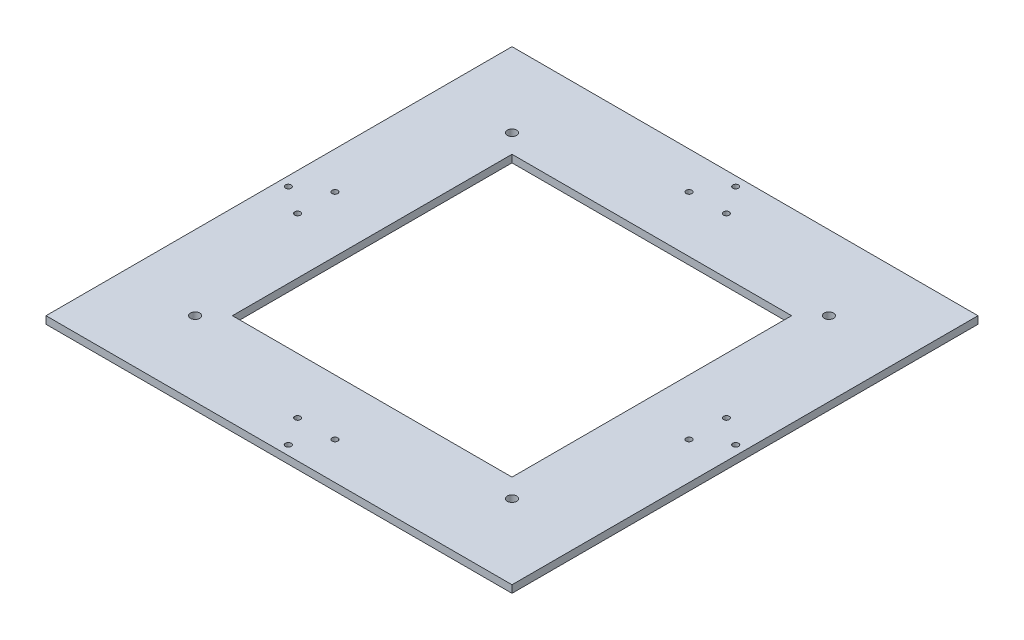
ISO-10303-21;
HEADER;
FILE_DESCRIPTION(('STEP AP214'),'2;1');
FILE_NAME('part.step','',(''),(''),'','','');
FILE_SCHEMA(('AUTOMOTIVE_DESIGN { 1 0 10303 214 1 1 1 1 }'));
ENDSEC;
DATA;
#1=APPLICATION_CONTEXT('core data for automotive mechanical design processes');
#2=APPLICATION_PROTOCOL_DEFINITION('international standard','automotive_design',2000,#1);
#3=PRODUCT_CONTEXT('',#1,'mechanical');
#4=PRODUCT('Part','Part','',(#3));
#5=PRODUCT_RELATED_PRODUCT_CATEGORY('part','',(#4));
#6=PRODUCT_DEFINITION_FORMATION('','',#4);
#7=PRODUCT_DEFINITION_CONTEXT('part definition',#1,'design');
#8=PRODUCT_DEFINITION('design','',#6,#7);
#9=PRODUCT_DEFINITION_SHAPE('','',#8);
#10=(LENGTH_UNIT() NAMED_UNIT(*) SI_UNIT(.MILLI.,.METRE.));
#11=(NAMED_UNIT(*) PLANE_ANGLE_UNIT() SI_UNIT($,.RADIAN.));
#12=(NAMED_UNIT(*) SI_UNIT($,.STERADIAN.) SOLID_ANGLE_UNIT());
#13=UNCERTAINTY_MEASURE_WITH_UNIT(LENGTH_MEASURE(1.E-05),#10,'distance_accuracy_value','');
#14=(GEOMETRIC_REPRESENTATION_CONTEXT(3) GLOBAL_UNCERTAINTY_ASSIGNED_CONTEXT((#13)) GLOBAL_UNIT_ASSIGNED_CONTEXT((#10,
#11,#12)) REPRESENTATION_CONTEXT('',''));
#15=CARTESIAN_POINT('',(0.,0.,0.));
#16=DIRECTION('',(0.,0.,1.));
#17=DIRECTION('',(1.,0.,0.));
#18=AXIS2_PLACEMENT_3D('',#15,#16,#17);
#19=CARTESIAN_POINT('',(0.,4.,0.));
#20=DIRECTION('',(0.,-1.,0.));
#21=DIRECTION('',(0.,0.,-1.));
#22=AXIS2_PLACEMENT_3D('',#19,#20,#21);
#23=PLANE('',#22);
#24=CARTESIAN_POINT('',(19.9999999999999,4.,-115.));
#25=DIRECTION('',(0.,1.,0.));
#26=DIRECTION('',(0.,0.,1.));
#27=AXIS2_PLACEMENT_3D('',#24,#25,#26);
#28=CIRCLE('',#27,1.54999999999999);
#29=CARTESIAN_POINT('',(19.9999999999999,4.,-113.45));
#30=VERTEX_POINT('',#29);
#31=EDGE_CURVE('E245',#30,#30,#28,.T.);
#32=ORIENTED_EDGE('',*,*,#31,.F.);
#33=EDGE_LOOP('',(#32));
#34=FACE_BOUND('',#33,.T.);
#35=CARTESIAN_POINT('',(125.000000000001,4.,-245.));
#36=DIRECTION('',(0.,1.,0.));
#37=DIRECTION('',(0.,0.,1.));
#38=AXIS2_PLACEMENT_3D('',#35,#36,#37);
#39=CIRCLE('',#38,1.54999999999997);
#40=CARTESIAN_POINT('',(125.000000000001,4.,-243.45));
#41=VERTEX_POINT('',#40);
#42=EDGE_CURVE('E248',#41,#41,#39,.T.);
#43=ORIENTED_EDGE('',*,*,#42,.F.);
#44=EDGE_LOOP('',(#43));
#45=FACE_BOUND('',#44,.T.);
#46=CARTESIAN_POINT('',(135.000000000001,4.,-230.));
#47=DIRECTION('',(0.,1.,0.));
#48=DIRECTION('',(0.,0.,1.));
#49=AXIS2_PLACEMENT_3D('',#46,#47,#48);
#50=CIRCLE('',#49,1.54999999999998);
#51=CARTESIAN_POINT('',(135.000000000001,4.,-228.45));
#52=VERTEX_POINT('',#51);
#53=EDGE_CURVE('E251',#52,#52,#50,.T.);
#54=ORIENTED_EDGE('',*,*,#53,.F.);
#55=EDGE_LOOP('',(#54));
#56=FACE_BOUND('',#55,.T.);
#57=CARTESIAN_POINT('',(115.000000000001,4.,-230.));
#58=DIRECTION('',(0.,1.,0.));
#59=DIRECTION('',(0.,0.,1.));
#60=AXIS2_PLACEMENT_3D('',#57,#58,#59);
#61=CIRCLE('',#60,1.54999999999999);
#62=CARTESIAN_POINT('',(115.000000000001,4.,-228.45));
#63=VERTEX_POINT('',#62);
#64=EDGE_CURVE('E241',#63,#63,#61,.T.);
#65=ORIENTED_EDGE('',*,*,#64,.F.);
#66=EDGE_LOOP('',(#65));
#67=FACE_BOUND('',#66,.T.);
#68=CARTESIAN_POINT('',(19.9999999999999,4.,-135.));
#69=DIRECTION('',(0.,1.,0.));
#70=DIRECTION('',(0.,0.,1.));
#71=AXIS2_PLACEMENT_3D('',#68,#69,#70);
#72=CIRCLE('',#71,1.54999999999999);
#73=CARTESIAN_POINT('',(19.9999999999999,4.,-133.45));
#74=VERTEX_POINT('',#73);
#75=EDGE_CURVE('E242',#74,#74,#72,.T.);
#76=ORIENTED_EDGE('',*,*,#75,.F.);
#77=EDGE_LOOP('',(#76));
#78=FACE_BOUND('',#77,.T.);
#79=CARTESIAN_POINT('',(4.99999999999991,4.,-125.));
#80=DIRECTION('',(0.,1.,0.));
#81=DIRECTION('',(0.,0.,1.));
#82=AXIS2_PLACEMENT_3D('',#79,#80,#81);
#83=CIRCLE('',#82,1.55000000000002);
#84=CARTESIAN_POINT('',(4.99999999999991,4.,-123.45));
#85=VERTEX_POINT('',#84);
#86=EDGE_CURVE('E207',#85,#85,#83,.T.);
#87=ORIENTED_EDGE('',*,*,#86,.F.);
#88=EDGE_LOOP('',(#87));
#89=FACE_BOUND('',#88,.T.);
#90=CARTESIAN_POINT('',(245.,4.,-124.999999999999));
#91=DIRECTION('',(0.,1.,0.));
#92=DIRECTION('',(0.,0.,1.));
#93=AXIS2_PLACEMENT_3D('',#90,#91,#92);
#94=CIRCLE('',#93,1.54999999999997);
#95=CARTESIAN_POINT('',(245.,4.,-123.449999999999));
#96=VERTEX_POINT('',#95);
#97=EDGE_CURVE('E238',#96,#96,#94,.T.);
#98=ORIENTED_EDGE('',*,*,#97,.F.);
#99=EDGE_LOOP('',(#98));
#100=FACE_BOUND('',#99,.T.);
#101=CARTESIAN_POINT('',(230.,4.,-114.999999999999));
#102=DIRECTION('',(0.,1.,0.));
#103=DIRECTION('',(0.,0.,1.));
#104=AXIS2_PLACEMENT_3D('',#101,#102,#103);
#105=CIRCLE('',#104,1.54999999999998);
#106=CARTESIAN_POINT('',(230.,4.,-113.449999999999));
#107=VERTEX_POINT('',#106);
#108=EDGE_CURVE('E235',#107,#107,#105,.T.);
#109=ORIENTED_EDGE('',*,*,#108,.F.);
#110=EDGE_LOOP('',(#109));
#111=FACE_BOUND('',#110,.T.);
#112=CARTESIAN_POINT('',(230.,4.,-134.999999999999));
#113=DIRECTION('',(0.,1.,0.));
#114=DIRECTION('',(0.,0.,1.));
#115=AXIS2_PLACEMENT_3D('',#112,#113,#114);
#116=CIRCLE('',#115,1.54999999999999);
#117=CARTESIAN_POINT('',(230.,4.,-133.449999999999));
#118=VERTEX_POINT('',#117);
#119=EDGE_CURVE('E232',#118,#118,#116,.T.);
#120=ORIENTED_EDGE('',*,*,#119,.F.);
#121=EDGE_LOOP('',(#120));
#122=FACE_BOUND('',#121,.T.);
#123=DIRECTION('',(0.,0.,1.));
#124=VECTOR('',#123,1.);
#125=CARTESIAN_POINT('',(49.9999999999999,4.,-200.));
#126=LINE('',#125,#124);
#127=CARTESIAN_POINT('',(49.9999999999999,4.,-200.));
#128=VERTEX_POINT('',#127);
#129=CARTESIAN_POINT('',(49.9999999999999,4.,-50.));
#130=VERTEX_POINT('',#129);
#131=EDGE_CURVE('E112',#128,#130,#126,.T.);
#132=ORIENTED_EDGE('',*,*,#131,.F.);
#133=DIRECTION('',(-1.,0.,0.));
#134=VECTOR('',#133,1.);
#135=CARTESIAN_POINT('',(200.,4.,-200.));
#136=LINE('',#135,#134);
#137=CARTESIAN_POINT('',(200.,4.,-200.));
#138=VERTEX_POINT('',#137);
#139=EDGE_CURVE('E51',#138,#128,#136,.T.);
#140=ORIENTED_EDGE('',*,*,#139,.F.);
#141=DIRECTION('',(0.,0.,-1.));
#142=VECTOR('',#141,1.);
#143=CARTESIAN_POINT('',(200.,4.,-50.));
#144=LINE('',#143,#142);
#145=CARTESIAN_POINT('',(200.,4.,-50.));
#146=VERTEX_POINT('',#145);
#147=EDGE_CURVE('E118',#146,#138,#144,.T.);
#148=ORIENTED_EDGE('',*,*,#147,.F.);
#149=DIRECTION('',(1.,0.,0.));
#150=VECTOR('',#149,1.);
#151=CARTESIAN_POINT('',(49.9999999999999,4.,-50.));
#152=LINE('',#151,#150);
#153=EDGE_CURVE('E103',#130,#146,#152,.T.);
#154=ORIENTED_EDGE('',*,*,#153,.F.);
#155=EDGE_LOOP('',(#132,#140,#148,#154));
#156=FACE_BOUND('',#155,.T.);
#157=CARTESIAN_POINT('',(115.,4.,-20.));
#158=DIRECTION('',(0.,1.,0.));
#159=DIRECTION('',(0.,0.,1.));
#160=AXIS2_PLACEMENT_3D('',#157,#158,#159);
#161=CIRCLE('',#160,1.54999999999999);
#162=CARTESIAN_POINT('',(115.,4.,-18.45));
#163=VERTEX_POINT('',#162);
#164=EDGE_CURVE('E128',#163,#163,#161,.T.);
#165=ORIENTED_EDGE('',*,*,#164,.F.);
#166=EDGE_LOOP('',(#165));
#167=FACE_BOUND('',#166,.T.);
#168=CARTESIAN_POINT('',(135.,4.,-20.));
#169=DIRECTION('',(0.,1.,0.));
#170=DIRECTION('',(0.,0.,1.));
#171=AXIS2_PLACEMENT_3D('',#168,#169,#170);
#172=CIRCLE('',#171,1.54999999999999);
#173=CARTESIAN_POINT('',(135.,4.,-18.45));
#174=VERTEX_POINT('',#173);
#175=EDGE_CURVE('E132',#174,#174,#172,.T.);
#176=ORIENTED_EDGE('',*,*,#175,.F.);
#177=EDGE_LOOP('',(#176));
#178=FACE_BOUND('',#177,.T.);
#179=CARTESIAN_POINT('',(125.,4.,-5.));
#180=DIRECTION('',(0.,1.,0.));
#181=DIRECTION('',(0.,0.,1.));
#182=AXIS2_PLACEMENT_3D('',#179,#180,#181);
#183=CIRCLE('',#182,1.54999999999999);
#184=CARTESIAN_POINT('',(125.,4.,-3.45000000000001));
#185=VERTEX_POINT('',#184);
#186=EDGE_CURVE('E125',#185,#185,#183,.T.);
#187=ORIENTED_EDGE('',*,*,#186,.F.);
#188=EDGE_LOOP('',(#187));
#189=FACE_BOUND('',#188,.T.);
#190=DIRECTION('',(0.,0.,1.));
#191=VECTOR('',#190,1.);
#192=CARTESIAN_POINT('',(0.,4.,0.));
#193=LINE('',#192,#191);
#194=CARTESIAN_POINT('',(0.,4.,-250.));
#195=VERTEX_POINT('',#194);
#196=CARTESIAN_POINT('',(0.,4.,0.));
#197=VERTEX_POINT('',#196);
#198=EDGE_CURVE('E163',#195,#197,#193,.T.);
#199=ORIENTED_EDGE('',*,*,#198,.T.);
#200=DIRECTION('',(1.,0.,0.));
#201=VECTOR('',#200,1.);
#202=CARTESIAN_POINT('',(0.,4.,0.));
#203=LINE('',#202,#201);
#204=CARTESIAN_POINT('',(250.,4.,0.));
#205=VERTEX_POINT('',#204);
#206=EDGE_CURVE('E166',#197,#205,#203,.T.);
#207=ORIENTED_EDGE('',*,*,#206,.T.);
#208=DIRECTION('',(0.,0.,-1.));
#209=VECTOR('',#208,1.);
#210=CARTESIAN_POINT('',(250.,4.,0.));
#211=LINE('',#210,#209);
#212=CARTESIAN_POINT('',(250.,4.,-250.));
#213=VERTEX_POINT('',#212);
#214=EDGE_CURVE('E169',#205,#213,#211,.T.);
#215=ORIENTED_EDGE('',*,*,#214,.T.);
#216=DIRECTION('',(-1.,0.,0.));
#217=VECTOR('',#216,1.);
#218=CARTESIAN_POINT('',(0.,4.,-250.));
#219=LINE('',#218,#217);
#220=EDGE_CURVE('E171',#213,#195,#219,.T.);
#221=ORIENTED_EDGE('',*,*,#220,.T.);
#222=EDGE_LOOP('',(#199,#207,#215,#221));
#223=FACE_BOUND('',#222,.T.);
#224=CARTESIAN_POINT('',(39.9999999999999,4.,-210.));
#225=DIRECTION('',(0.,1.,0.));
#226=DIRECTION('',(0.,0.,1.));
#227=AXIS2_PLACEMENT_3D('',#224,#225,#226);
#228=CIRCLE('',#227,2.5);
#229=CARTESIAN_POINT('',(39.9999999999999,4.,-207.5));
#230=VERTEX_POINT('',#229);
#231=EDGE_CURVE('E157',#230,#230,#228,.T.);
#232=ORIENTED_EDGE('',*,*,#231,.F.);
#233=EDGE_LOOP('',(#232));
#234=FACE_BOUND('',#233,.T.);
#235=CARTESIAN_POINT('',(210.,4.,-210.));
#236=DIRECTION('',(0.,1.,0.));
#237=DIRECTION('',(0.,0.,1.));
#238=AXIS2_PLACEMENT_3D('',#235,#236,#237);
#239=CIRCLE('',#238,2.5);
#240=CARTESIAN_POINT('',(210.,4.,-207.5));
#241=VERTEX_POINT('',#240);
#242=EDGE_CURVE('E151',#241,#241,#239,.T.);
#243=ORIENTED_EDGE('',*,*,#242,.F.);
#244=EDGE_LOOP('',(#243));
#245=FACE_BOUND('',#244,.T.);
#246=CARTESIAN_POINT('',(210.,4.,-40.));
#247=DIRECTION('',(0.,1.,0.));
#248=DIRECTION('',(0.,0.,1.));
#249=AXIS2_PLACEMENT_3D('',#246,#247,#248);
#250=CIRCLE('',#249,2.5);
#251=CARTESIAN_POINT('',(210.,4.,-37.5));
#252=VERTEX_POINT('',#251);
#253=EDGE_CURVE('E145',#252,#252,#250,.T.);
#254=ORIENTED_EDGE('',*,*,#253,.F.);
#255=EDGE_LOOP('',(#254));
#256=FACE_BOUND('',#255,.T.);
#257=CARTESIAN_POINT('',(39.9999999999999,4.,-40.));
#258=DIRECTION('',(0.,1.,0.));
#259=DIRECTION('',(0.,0.,1.));
#260=AXIS2_PLACEMENT_3D('',#257,#258,#259);
#261=CIRCLE('',#260,2.5);
#262=CARTESIAN_POINT('',(39.9999999999999,4.,-37.5));
#263=VERTEX_POINT('',#262);
#264=EDGE_CURVE('E137',#263,#263,#261,.T.);
#265=ORIENTED_EDGE('',*,*,#264,.F.);
#266=EDGE_LOOP('',(#265));
#267=FACE_BOUND('',#266,.T.);
#268=ADVANCED_FACE('F34',(#34,#45,#56,#67,#78,#89,#100,#111,#122,#156,#167,#178,#189,#223,#234,
#245,#256,#267),#23,.F.);
#269=CARTESIAN_POINT('',(0.,0.,0.));
#270=DIRECTION('',(0.,-1.,0.));
#271=DIRECTION('',(0.,0.,-1.));
#272=AXIS2_PLACEMENT_3D('',#269,#270,#271);
#273=PLANE('',#272);
#274=CARTESIAN_POINT('',(19.9999999999999,0.,-115.));
#275=DIRECTION('',(0.,-1.,0.));
#276=DIRECTION('',(0.,0.,-1.));
#277=AXIS2_PLACEMENT_3D('',#274,#275,#276);
#278=CIRCLE('',#277,1.54999999999999);
#279=CARTESIAN_POINT('',(19.9999999999999,0.,-116.55));
#280=VERTEX_POINT('',#279);
#281=EDGE_CURVE('E38',#280,#280,#278,.T.);
#282=ORIENTED_EDGE('',*,*,#281,.F.);
#283=EDGE_LOOP('',(#282));
#284=FACE_BOUND('',#283,.T.);
#285=CARTESIAN_POINT('',(125.000000000001,0.,-245.));
#286=DIRECTION('',(0.,-1.,0.));
#287=DIRECTION('',(0.,0.,-1.));
#288=AXIS2_PLACEMENT_3D('',#285,#286,#287);
#289=CIRCLE('',#288,1.54999999999997);
#290=CARTESIAN_POINT('',(125.000000000001,0.,-246.55));
#291=VERTEX_POINT('',#290);
#292=EDGE_CURVE('E224',#291,#291,#289,.T.);
#293=ORIENTED_EDGE('',*,*,#292,.F.);
#294=EDGE_LOOP('',(#293));
#295=FACE_BOUND('',#294,.T.);
#296=CARTESIAN_POINT('',(135.000000000001,0.,-230.));
#297=DIRECTION('',(0.,-1.,0.));
#298=DIRECTION('',(0.,0.,-1.));
#299=AXIS2_PLACEMENT_3D('',#296,#297,#298);
#300=CIRCLE('',#299,1.54999999999998);
#301=CARTESIAN_POINT('',(135.000000000001,0.,-231.55));
#302=VERTEX_POINT('',#301);
#303=EDGE_CURVE('E222',#302,#302,#300,.T.);
#304=ORIENTED_EDGE('',*,*,#303,.F.);
#305=EDGE_LOOP('',(#304));
#306=FACE_BOUND('',#305,.T.);
#307=CARTESIAN_POINT('',(115.000000000001,0.,-230.));
#308=DIRECTION('',(0.,-1.,0.));
#309=DIRECTION('',(0.,0.,-1.));
#310=AXIS2_PLACEMENT_3D('',#307,#308,#309);
#311=CIRCLE('',#310,1.54999999999999);
#312=CARTESIAN_POINT('',(115.000000000001,0.,-231.55));
#313=VERTEX_POINT('',#312);
#314=EDGE_CURVE('E219',#313,#313,#311,.T.);
#315=ORIENTED_EDGE('',*,*,#314,.F.);
#316=EDGE_LOOP('',(#315));
#317=FACE_BOUND('',#316,.T.);
#318=CARTESIAN_POINT('',(19.9999999999999,0.,-135.));
#319=DIRECTION('',(0.,-1.,0.));
#320=DIRECTION('',(0.,0.,-1.));
#321=AXIS2_PLACEMENT_3D('',#318,#319,#320);
#322=CIRCLE('',#321,1.54999999999999);
#323=CARTESIAN_POINT('',(19.9999999999999,0.,-136.55));
#324=VERTEX_POINT('',#323);
#325=EDGE_CURVE('E216',#324,#324,#322,.T.);
#326=ORIENTED_EDGE('',*,*,#325,.F.);
#327=EDGE_LOOP('',(#326));
#328=FACE_BOUND('',#327,.T.);
#329=CARTESIAN_POINT('',(4.99999999999991,0.,-125.));
#330=DIRECTION('',(0.,-1.,0.));
#331=DIRECTION('',(0.,0.,-1.));
#332=AXIS2_PLACEMENT_3D('',#329,#330,#331);
#333=CIRCLE('',#332,1.55000000000002);
#334=CARTESIAN_POINT('',(4.99999999999991,0.,-126.55));
#335=VERTEX_POINT('',#334);
#336=EDGE_CURVE('E213',#335,#335,#333,.T.);
#337=ORIENTED_EDGE('',*,*,#336,.F.);
#338=EDGE_LOOP('',(#337));
#339=FACE_BOUND('',#338,.T.);
#340=CARTESIAN_POINT('',(245.,0.,-124.999999999999));
#341=DIRECTION('',(0.,-1.,0.));
#342=DIRECTION('',(0.,0.,-1.));
#343=AXIS2_PLACEMENT_3D('',#340,#341,#342);
#344=CIRCLE('',#343,1.54999999999997);
#345=CARTESIAN_POINT('',(245.,0.,-126.549999999999));
#346=VERTEX_POINT('',#345);
#347=EDGE_CURVE('E210',#346,#346,#344,.T.);
#348=ORIENTED_EDGE('',*,*,#347,.F.);
#349=EDGE_LOOP('',(#348));
#350=FACE_BOUND('',#349,.T.);
#351=CARTESIAN_POINT('',(230.,0.,-114.999999999999));
#352=DIRECTION('',(0.,-1.,0.));
#353=DIRECTION('',(0.,0.,-1.));
#354=AXIS2_PLACEMENT_3D('',#351,#352,#353);
#355=CIRCLE('',#354,1.54999999999998);
#356=CARTESIAN_POINT('',(230.,0.,-116.549999999999));
#357=VERTEX_POINT('',#356);
#358=EDGE_CURVE('E206',#357,#357,#355,.T.);
#359=ORIENTED_EDGE('',*,*,#358,.F.);
#360=EDGE_LOOP('',(#359));
#361=FACE_BOUND('',#360,.T.);
#362=CARTESIAN_POINT('',(230.,0.,-134.999999999999));
#363=DIRECTION('',(0.,-1.,0.));
#364=DIRECTION('',(0.,0.,-1.));
#365=AXIS2_PLACEMENT_3D('',#362,#363,#364);
#366=CIRCLE('',#365,1.54999999999999);
#367=CARTESIAN_POINT('',(230.,0.,-136.549999999999));
#368=VERTEX_POINT('',#367);
#369=EDGE_CURVE('E203',#368,#368,#366,.T.);
#370=ORIENTED_EDGE('',*,*,#369,.F.);
#371=EDGE_LOOP('',(#370));
#372=FACE_BOUND('',#371,.T.);
#373=DIRECTION('',(1.,0.,0.));
#374=VECTOR('',#373,1.);
#375=CARTESIAN_POINT('',(0.,0.,-200.));
#376=LINE('',#375,#374);
#377=CARTESIAN_POINT('',(49.9999999999999,0.,-200.));
#378=VERTEX_POINT('',#377);
#379=CARTESIAN_POINT('',(200.,0.,-200.));
#380=VERTEX_POINT('',#379);
#381=EDGE_CURVE('E11',#378,#380,#376,.T.);
#382=ORIENTED_EDGE('',*,*,#381,.F.);
#383=DIRECTION('',(0.,0.,-1.));
#384=VECTOR('',#383,1.);
#385=CARTESIAN_POINT('',(49.9999999999999,0.,0.));
#386=LINE('',#385,#384);
#387=CARTESIAN_POINT('',(49.9999999999999,0.,-50.));
#388=VERTEX_POINT('',#387);
#389=EDGE_CURVE('E192',#388,#378,#386,.T.);
#390=ORIENTED_EDGE('',*,*,#389,.F.);
#391=DIRECTION('',(-1.,0.,0.));
#392=VECTOR('',#391,1.);
#393=CARTESIAN_POINT('',(0.,0.,-50.));
#394=LINE('',#393,#392);
#395=CARTESIAN_POINT('',(200.,0.,-50.));
#396=VERTEX_POINT('',#395);
#397=EDGE_CURVE('E106',#396,#388,#394,.T.);
#398=ORIENTED_EDGE('',*,*,#397,.F.);
#399=DIRECTION('',(0.,0.,1.));
#400=VECTOR('',#399,1.);
#401=CARTESIAN_POINT('',(200.,0.,0.));
#402=LINE('',#401,#400);
#403=EDGE_CURVE('E43',#380,#396,#402,.T.);
#404=ORIENTED_EDGE('',*,*,#403,.F.);
#405=EDGE_LOOP('',(#382,#390,#398,#404));
#406=FACE_BOUND('',#405,.T.);
#407=CARTESIAN_POINT('',(115.,0.,-20.));
#408=DIRECTION('',(0.,-1.,0.));
#409=DIRECTION('',(0.,0.,-1.));
#410=AXIS2_PLACEMENT_3D('',#407,#408,#409);
#411=CIRCLE('',#410,1.54999999999999);
#412=CARTESIAN_POINT('',(115.,0.,-21.55));
#413=VERTEX_POINT('',#412);
#414=EDGE_CURVE('E144',#413,#413,#411,.T.);
#415=ORIENTED_EDGE('',*,*,#414,.F.);
#416=EDGE_LOOP('',(#415));
#417=FACE_BOUND('',#416,.T.);
#418=CARTESIAN_POINT('',(135.,0.,-20.));
#419=DIRECTION('',(0.,-1.,0.));
#420=DIRECTION('',(0.,0.,-1.));
#421=AXIS2_PLACEMENT_3D('',#418,#419,#420);
#422=CIRCLE('',#421,1.54999999999999);
#423=CARTESIAN_POINT('',(135.,0.,-21.55));
#424=VERTEX_POINT('',#423);
#425=EDGE_CURVE('E195',#424,#424,#422,.T.);
#426=ORIENTED_EDGE('',*,*,#425,.F.);
#427=EDGE_LOOP('',(#426));
#428=FACE_BOUND('',#427,.T.);
#429=CARTESIAN_POINT('',(125.,0.,-5.));
#430=DIRECTION('',(0.,-1.,0.));
#431=DIRECTION('',(0.,0.,-1.));
#432=AXIS2_PLACEMENT_3D('',#429,#430,#431);
#433=CIRCLE('',#432,1.54999999999999);
#434=CARTESIAN_POINT('',(125.,0.,-6.54999999999999));
#435=VERTEX_POINT('',#434);
#436=EDGE_CURVE('E131',#435,#435,#433,.T.);
#437=ORIENTED_EDGE('',*,*,#436,.F.);
#438=EDGE_LOOP('',(#437));
#439=FACE_BOUND('',#438,.T.);
#440=CARTESIAN_POINT('',(210.,0.,-40.));
#441=DIRECTION('',(0.,1.,0.));
#442=DIRECTION('',(0.,0.,1.));
#443=AXIS2_PLACEMENT_3D('',#440,#441,#442);
#444=CIRCLE('',#443,2.5);
#445=CARTESIAN_POINT('',(210.,0.,-37.5));
#446=VERTEX_POINT('',#445);
#447=EDGE_CURVE('E140',#446,#446,#444,.T.);
#448=ORIENTED_EDGE('',*,*,#447,.T.);
#449=EDGE_LOOP('',(#448));
#450=FACE_BOUND('',#449,.T.);
#451=CARTESIAN_POINT('',(39.9999999999999,0.,-210.));
#452=DIRECTION('',(0.,1.,0.));
#453=DIRECTION('',(0.,0.,1.));
#454=AXIS2_PLACEMENT_3D('',#451,#452,#453);
#455=CIRCLE('',#454,2.5);
#456=CARTESIAN_POINT('',(39.9999999999999,0.,-207.5));
#457=VERTEX_POINT('',#456);
#458=EDGE_CURVE('E154',#457,#457,#455,.T.);
#459=ORIENTED_EDGE('',*,*,#458,.T.);
#460=EDGE_LOOP('',(#459));
#461=FACE_BOUND('',#460,.T.);
#462=DIRECTION('',(0.,0.,1.));
#463=VECTOR('',#462,1.);
#464=CARTESIAN_POINT('',(0.,0.,0.));
#465=LINE('',#464,#463);
#466=CARTESIAN_POINT('',(0.,0.,-250.));
#467=VERTEX_POINT('',#466);
#468=CARTESIAN_POINT('',(0.,0.,0.));
#469=VERTEX_POINT('',#468);
#470=EDGE_CURVE('E160',#467,#469,#465,.T.);
#471=ORIENTED_EDGE('',*,*,#470,.F.);
#472=DIRECTION('',(-1.,0.,0.));
#473=VECTOR('',#472,1.);
#474=CARTESIAN_POINT('',(0.,0.,-250.));
#475=LINE('',#474,#473);
#476=CARTESIAN_POINT('',(250.,0.,-250.));
#477=VERTEX_POINT('',#476);
#478=EDGE_CURVE('E167',#477,#467,#475,.T.);
#479=ORIENTED_EDGE('',*,*,#478,.F.);
#480=DIRECTION('',(0.,0.,-1.));
#481=VECTOR('',#480,1.);
#482=CARTESIAN_POINT('',(250.,0.,0.));
#483=LINE('',#482,#481);
#484=CARTESIAN_POINT('',(250.,0.,0.));
#485=VERTEX_POINT('',#484);
#486=EDGE_CURVE('E178',#485,#477,#483,.T.);
#487=ORIENTED_EDGE('',*,*,#486,.F.);
#488=DIRECTION('',(1.,0.,0.));
#489=VECTOR('',#488,1.);
#490=CARTESIAN_POINT('',(0.,0.,0.));
#491=LINE('',#490,#489);
#492=EDGE_CURVE('E176',#469,#485,#491,.T.);
#493=ORIENTED_EDGE('',*,*,#492,.F.);
#494=EDGE_LOOP('',(#471,#479,#487,#493));
#495=FACE_BOUND('',#494,.T.);
#496=CARTESIAN_POINT('',(210.,0.,-210.));
#497=DIRECTION('',(0.,1.,0.));
#498=DIRECTION('',(0.,0.,1.));
#499=AXIS2_PLACEMENT_3D('',#496,#497,#498);
#500=CIRCLE('',#499,2.5);
#501=CARTESIAN_POINT('',(210.,0.,-207.5));
#502=VERTEX_POINT('',#501);
#503=EDGE_CURVE('E148',#502,#502,#500,.T.);
#504=ORIENTED_EDGE('',*,*,#503,.T.);
#505=EDGE_LOOP('',(#504));
#506=FACE_BOUND('',#505,.T.);
#507=CARTESIAN_POINT('',(39.9999999999999,0.,-40.));
#508=DIRECTION('',(0.,1.,0.));
#509=DIRECTION('',(0.,0.,1.));
#510=AXIS2_PLACEMENT_3D('',#507,#508,#509);
#511=CIRCLE('',#510,2.5);
#512=CARTESIAN_POINT('',(39.9999999999999,0.,-37.5));
#513=VERTEX_POINT('',#512);
#514=EDGE_CURVE('E141',#513,#513,#511,.T.);
#515=ORIENTED_EDGE('',*,*,#514,.T.);
#516=EDGE_LOOP('',(#515));
#517=FACE_BOUND('',#516,.T.);
#518=ADVANCED_FACE('F263',(#284,#295,#306,#317,#328,#339,#350,#361,#372,#406,#417,#428,#439,
#450,#461,#495,#506,#517),#273,.T.);
#519=CARTESIAN_POINT('',(0.,4.,0.));
#520=DIRECTION('',(1.,0.,0.));
#521=DIRECTION('',(0.,0.,-1.));
#522=AXIS2_PLACEMENT_3D('',#519,#520,#521);
#523=PLANE('',#522);
#524=ORIENTED_EDGE('',*,*,#470,.T.);
#525=DIRECTION('',(0.,-1.,0.));
#526=VECTOR('',#525,1.);
#527=CARTESIAN_POINT('',(0.,4.,0.));
#528=LINE('',#527,#526);
#529=EDGE_CURVE('E189',#197,#469,#528,.T.);
#530=ORIENTED_EDGE('',*,*,#529,.F.);
#531=ORIENTED_EDGE('',*,*,#198,.F.);
#532=DIRECTION('',(0.,-1.,0.));
#533=VECTOR('',#532,1.);
#534=CARTESIAN_POINT('',(0.,4.,-250.));
#535=LINE('',#534,#533);
#536=EDGE_CURVE('E173',#195,#467,#535,.T.);
#537=ORIENTED_EDGE('',*,*,#536,.T.);
#538=EDGE_LOOP('',(#524,#530,#531,#537));
#539=FACE_BOUND('',#538,.T.);
#540=ADVANCED_FACE('F36',(#539),#523,.F.);
#541=CARTESIAN_POINT('',(0.,4.,0.));
#542=DIRECTION('',(0.,0.,-1.));
#543=DIRECTION('',(-1.,0.,0.));
#544=AXIS2_PLACEMENT_3D('',#541,#542,#543);
#545=PLANE('',#544);
#546=ORIENTED_EDGE('',*,*,#492,.T.);
#547=DIRECTION('',(0.,-1.,0.));
#548=VECTOR('',#547,1.);
#549=CARTESIAN_POINT('',(250.,4.,0.));
#550=LINE('',#549,#548);
#551=EDGE_CURVE('E186',#205,#485,#550,.T.);
#552=ORIENTED_EDGE('',*,*,#551,.F.);
#553=ORIENTED_EDGE('',*,*,#206,.F.);
#554=ORIENTED_EDGE('',*,*,#529,.T.);
#555=EDGE_LOOP('',(#546,#552,#553,#554));
#556=FACE_BOUND('',#555,.T.);
#557=ADVANCED_FACE('F339',(#556),#545,.F.);
#558=CARTESIAN_POINT('',(250.,4.,0.));
#559=DIRECTION('',(-1.,0.,0.));
#560=DIRECTION('',(0.,0.,1.));
#561=AXIS2_PLACEMENT_3D('',#558,#559,#560);
#562=PLANE('',#561);
#563=ORIENTED_EDGE('',*,*,#486,.T.);
#564=DIRECTION('',(0.,-1.,0.));
#565=VECTOR('',#564,1.);
#566=CARTESIAN_POINT('',(250.,4.,-250.));
#567=LINE('',#566,#565);
#568=EDGE_CURVE('E183',#213,#477,#567,.T.);
#569=ORIENTED_EDGE('',*,*,#568,.F.);
#570=ORIENTED_EDGE('',*,*,#214,.F.);
#571=ORIENTED_EDGE('',*,*,#551,.T.);
#572=EDGE_LOOP('',(#563,#569,#570,#571));
#573=FACE_BOUND('',#572,.T.);
#574=ADVANCED_FACE('F336',(#573),#562,.F.);
#575=CARTESIAN_POINT('',(0.,4.,-250.));
#576=DIRECTION('',(0.,0.,1.));
#577=DIRECTION('',(1.,0.,0.));
#578=AXIS2_PLACEMENT_3D('',#575,#576,#577);
#579=PLANE('',#578);
#580=ORIENTED_EDGE('',*,*,#478,.T.);
#581=ORIENTED_EDGE('',*,*,#536,.F.);
#582=ORIENTED_EDGE('',*,*,#220,.F.);
#583=ORIENTED_EDGE('',*,*,#568,.T.);
#584=EDGE_LOOP('',(#580,#581,#582,#583));
#585=FACE_BOUND('',#584,.T.);
#586=ADVANCED_FACE('F328',(#585),#579,.F.);
#587=CARTESIAN_POINT('',(39.9999999999999,4.,-210.));
#588=DIRECTION('',(0.,-1.,0.));
#589=DIRECTION('',(0.,0.,-1.));
#590=AXIS2_PLACEMENT_3D('',#587,#588,#589);
#591=CYLINDRICAL_SURFACE('',#590,2.5);
#592=ORIENTED_EDGE('',*,*,#231,.T.);
#593=EDGE_LOOP('',(#592));
#594=FACE_BOUND('',#593,.T.);
#595=ORIENTED_EDGE('',*,*,#458,.F.);
#596=EDGE_LOOP('',(#595));
#597=FACE_BOUND('',#596,.T.);
#598=ADVANCED_FACE('F325',(#594,#597),#591,.F.);
#599=CARTESIAN_POINT('',(210.,4.,-210.));
#600=DIRECTION('',(0.,-1.,0.));
#601=DIRECTION('',(0.,0.,-1.));
#602=AXIS2_PLACEMENT_3D('',#599,#600,#601);
#603=CYLINDRICAL_SURFACE('',#602,2.5);
#604=ORIENTED_EDGE('',*,*,#242,.T.);
#605=EDGE_LOOP('',(#604));
#606=FACE_BOUND('',#605,.T.);
#607=ORIENTED_EDGE('',*,*,#503,.F.);
#608=EDGE_LOOP('',(#607));
#609=FACE_BOUND('',#608,.T.);
#610=ADVANCED_FACE('F321',(#606,#609),#603,.F.);
#611=CARTESIAN_POINT('',(210.,4.,-40.));
#612=DIRECTION('',(0.,-1.,0.));
#613=DIRECTION('',(0.,0.,-1.));
#614=AXIS2_PLACEMENT_3D('',#611,#612,#613);
#615=CYLINDRICAL_SURFACE('',#614,2.5);
#616=ORIENTED_EDGE('',*,*,#253,.T.);
#617=EDGE_LOOP('',(#616));
#618=FACE_BOUND('',#617,.T.);
#619=ORIENTED_EDGE('',*,*,#447,.F.);
#620=EDGE_LOOP('',(#619));
#621=FACE_BOUND('',#620,.T.);
#622=ADVANCED_FACE('F317',(#618,#621),#615,.F.);
#623=CARTESIAN_POINT('',(39.9999999999999,4.,-40.));
#624=DIRECTION('',(0.,-1.,0.));
#625=DIRECTION('',(0.,0.,-1.));
#626=AXIS2_PLACEMENT_3D('',#623,#624,#625);
#627=CYLINDRICAL_SURFACE('',#626,2.5);
#628=ORIENTED_EDGE('',*,*,#264,.T.);
#629=EDGE_LOOP('',(#628));
#630=FACE_BOUND('',#629,.T.);
#631=ORIENTED_EDGE('',*,*,#514,.F.);
#632=EDGE_LOOP('',(#631));
#633=FACE_BOUND('',#632,.T.);
#634=ADVANCED_FACE('F313',(#630,#633),#627,.F.);
#635=CARTESIAN_POINT('',(125.,-6.,-5.));
#636=DIRECTION('',(0.,1.,0.));
#637=DIRECTION('',(0.,0.,1.));
#638=AXIS2_PLACEMENT_3D('',#635,#636,#637);
#639=CYLINDRICAL_SURFACE('',#638,1.54999999999999);
#640=ORIENTED_EDGE('',*,*,#436,.T.);
#641=EDGE_LOOP('',(#640));
#642=FACE_BOUND('',#641,.T.);
#643=ORIENTED_EDGE('',*,*,#186,.T.);
#644=EDGE_LOOP('',(#643));
#645=FACE_BOUND('',#644,.T.);
#646=ADVANCED_FACE('F309',(#642,#645),#639,.F.);
#647=CARTESIAN_POINT('',(135.,-6.,-20.));
#648=DIRECTION('',(0.,1.,0.));
#649=DIRECTION('',(0.,0.,1.));
#650=AXIS2_PLACEMENT_3D('',#647,#648,#649);
#651=CYLINDRICAL_SURFACE('',#650,1.54999999999999);
#652=ORIENTED_EDGE('',*,*,#425,.T.);
#653=EDGE_LOOP('',(#652));
#654=FACE_BOUND('',#653,.T.);
#655=ORIENTED_EDGE('',*,*,#175,.T.);
#656=EDGE_LOOP('',(#655));
#657=FACE_BOUND('',#656,.T.);
#658=ADVANCED_FACE('F305',(#654,#657),#651,.F.);
#659=CARTESIAN_POINT('',(115.,-6.,-20.));
#660=DIRECTION('',(0.,1.,0.));
#661=DIRECTION('',(0.,0.,1.));
#662=AXIS2_PLACEMENT_3D('',#659,#660,#661);
#663=CYLINDRICAL_SURFACE('',#662,1.54999999999999);
#664=ORIENTED_EDGE('',*,*,#414,.T.);
#665=EDGE_LOOP('',(#664));
#666=FACE_BOUND('',#665,.T.);
#667=ORIENTED_EDGE('',*,*,#164,.T.);
#668=EDGE_LOOP('',(#667));
#669=FACE_BOUND('',#668,.T.);
#670=ADVANCED_FACE('F302',(#666,#669),#663,.F.);
#671=CARTESIAN_POINT('',(200.,-6.,-200.));
#672=DIRECTION('',(0.,0.,-1.));
#673=DIRECTION('',(-1.,0.,0.));
#674=AXIS2_PLACEMENT_3D('',#671,#672,#673);
#675=PLANE('',#674);
#676=ORIENTED_EDGE('',*,*,#381,.T.);
#677=DIRECTION('',(0.,1.,0.));
#678=VECTOR('',#677,1.);
#679=CARTESIAN_POINT('',(200.,-6.,-200.));
#680=LINE('',#679,#678);
#681=EDGE_CURVE('E123',#380,#138,#680,.T.);
#682=ORIENTED_EDGE('',*,*,#681,.T.);
#683=ORIENTED_EDGE('',*,*,#139,.T.);
#684=DIRECTION('',(0.,1.,0.));
#685=VECTOR('',#684,1.);
#686=CARTESIAN_POINT('',(49.9999999999999,-6.,-200.));
#687=LINE('',#686,#685);
#688=EDGE_CURVE('E109',#378,#128,#687,.T.);
#689=ORIENTED_EDGE('',*,*,#688,.F.);
#690=EDGE_LOOP('',(#676,#682,#683,#689));
#691=FACE_BOUND('',#690,.T.);
#692=ADVANCED_FACE('F296',(#691),#675,.F.);
#693=CARTESIAN_POINT('',(200.,-6.,-50.));
#694=DIRECTION('',(1.,0.,0.));
#695=DIRECTION('',(0.,0.,-1.));
#696=AXIS2_PLACEMENT_3D('',#693,#694,#695);
#697=PLANE('',#696);
#698=ORIENTED_EDGE('',*,*,#403,.T.);
#699=DIRECTION('',(0.,1.,0.));
#700=VECTOR('',#699,1.);
#701=CARTESIAN_POINT('',(200.,-6.,-50.));
#702=LINE('',#701,#700);
#703=EDGE_CURVE('E108',#396,#146,#702,.T.);
#704=ORIENTED_EDGE('',*,*,#703,.T.);
#705=ORIENTED_EDGE('',*,*,#147,.T.);
#706=ORIENTED_EDGE('',*,*,#681,.F.);
#707=EDGE_LOOP('',(#698,#704,#705,#706));
#708=FACE_BOUND('',#707,.T.);
#709=ADVANCED_FACE('F293',(#708),#697,.F.);
#710=CARTESIAN_POINT('',(49.9999999999999,-6.,-50.));
#711=DIRECTION('',(0.,0.,1.));
#712=DIRECTION('',(1.,0.,0.));
#713=AXIS2_PLACEMENT_3D('',#710,#711,#712);
#714=PLANE('',#713);
#715=ORIENTED_EDGE('',*,*,#397,.T.);
#716=DIRECTION('',(0.,1.,0.));
#717=VECTOR('',#716,1.);
#718=CARTESIAN_POINT('',(49.9999999999999,-6.,-50.));
#719=LINE('',#718,#717);
#720=EDGE_CURVE('E59',#388,#130,#719,.T.);
#721=ORIENTED_EDGE('',*,*,#720,.T.);
#722=ORIENTED_EDGE('',*,*,#153,.T.);
#723=ORIENTED_EDGE('',*,*,#703,.F.);
#724=EDGE_LOOP('',(#715,#721,#722,#723));
#725=FACE_BOUND('',#724,.T.);
#726=ADVANCED_FACE('F100',(#725),#714,.F.);
#727=CARTESIAN_POINT('',(49.9999999999999,-6.,-200.));
#728=DIRECTION('',(-1.,0.,0.));
#729=DIRECTION('',(0.,0.,1.));
#730=AXIS2_PLACEMENT_3D('',#727,#728,#729);
#731=PLANE('',#730);
#732=ORIENTED_EDGE('',*,*,#389,.T.);
#733=ORIENTED_EDGE('',*,*,#688,.T.);
#734=ORIENTED_EDGE('',*,*,#131,.T.);
#735=ORIENTED_EDGE('',*,*,#720,.F.);
#736=EDGE_LOOP('',(#732,#733,#734,#735));
#737=FACE_BOUND('',#736,.T.);
#738=ADVANCED_FACE('F113',(#737),#731,.F.);
#739=CARTESIAN_POINT('',(230.,-6.,-134.999999999999));
#740=DIRECTION('',(0.,1.,0.));
#741=DIRECTION('',(0.,0.,1.));
#742=AXIS2_PLACEMENT_3D('',#739,#740,#741);
#743=CYLINDRICAL_SURFACE('',#742,1.54999999999999);
#744=ORIENTED_EDGE('',*,*,#369,.T.);
#745=EDGE_LOOP('',(#744));
#746=FACE_BOUND('',#745,.T.);
#747=ORIENTED_EDGE('',*,*,#119,.T.);
#748=EDGE_LOOP('',(#747));
#749=FACE_BOUND('',#748,.T.);
#750=ADVANCED_FACE('F278',(#746,#749),#743,.F.);
#751=CARTESIAN_POINT('',(230.,-6.,-114.999999999999));
#752=DIRECTION('',(0.,1.,0.));
#753=DIRECTION('',(0.,0.,1.));
#754=AXIS2_PLACEMENT_3D('',#751,#752,#753);
#755=CYLINDRICAL_SURFACE('',#754,1.54999999999998);
#756=ORIENTED_EDGE('',*,*,#358,.T.);
#757=EDGE_LOOP('',(#756));
#758=FACE_BOUND('',#757,.T.);
#759=ORIENTED_EDGE('',*,*,#108,.T.);
#760=EDGE_LOOP('',(#759));
#761=FACE_BOUND('',#760,.T.);
#762=ADVANCED_FACE('F280',(#758,#761),#755,.F.);
#763=CARTESIAN_POINT('',(245.,-6.,-124.999999999999));
#764=DIRECTION('',(0.,1.,0.));
#765=DIRECTION('',(0.,0.,1.));
#766=AXIS2_PLACEMENT_3D('',#763,#764,#765);
#767=CYLINDRICAL_SURFACE('',#766,1.54999999999997);
#768=ORIENTED_EDGE('',*,*,#347,.T.);
#769=EDGE_LOOP('',(#768));
#770=FACE_BOUND('',#769,.T.);
#771=ORIENTED_EDGE('',*,*,#97,.T.);
#772=EDGE_LOOP('',(#771));
#773=FACE_BOUND('',#772,.T.);
#774=ADVANCED_FACE('F287',(#770,#773),#767,.F.);
#775=CARTESIAN_POINT('',(4.99999999999991,-6.,-125.));
#776=DIRECTION('',(0.,1.,0.));
#777=DIRECTION('',(0.,0.,1.));
#778=AXIS2_PLACEMENT_3D('',#775,#776,#777);
#779=CYLINDRICAL_SURFACE('',#778,1.55000000000002);
#780=ORIENTED_EDGE('',*,*,#336,.T.);
#781=EDGE_LOOP('',(#780));
#782=FACE_BOUND('',#781,.T.);
#783=ORIENTED_EDGE('',*,*,#86,.T.);
#784=EDGE_LOOP('',(#783));
#785=FACE_BOUND('',#784,.T.);
#786=ADVANCED_FACE('F502',(#782,#785),#779,.F.);
#787=CARTESIAN_POINT('',(19.9999999999999,-6.,-135.));
#788=DIRECTION('',(0.,1.,0.));
#789=DIRECTION('',(0.,0.,1.));
#790=AXIS2_PLACEMENT_3D('',#787,#788,#789);
#791=CYLINDRICAL_SURFACE('',#790,1.54999999999999);
#792=ORIENTED_EDGE('',*,*,#325,.T.);
#793=EDGE_LOOP('',(#792));
#794=FACE_BOUND('',#793,.T.);
#795=ORIENTED_EDGE('',*,*,#75,.T.);
#796=EDGE_LOOP('',(#795));
#797=FACE_BOUND('',#796,.T.);
#798=ADVANCED_FACE('F510',(#794,#797),#791,.F.);
#799=CARTESIAN_POINT('',(115.000000000001,-6.,-230.));
#800=DIRECTION('',(0.,1.,0.));
#801=DIRECTION('',(0.,0.,1.));
#802=AXIS2_PLACEMENT_3D('',#799,#800,#801);
#803=CYLINDRICAL_SURFACE('',#802,1.54999999999999);
#804=ORIENTED_EDGE('',*,*,#314,.T.);
#805=EDGE_LOOP('',(#804));
#806=FACE_BOUND('',#805,.T.);
#807=ORIENTED_EDGE('',*,*,#64,.T.);
#808=EDGE_LOOP('',(#807));
#809=FACE_BOUND('',#808,.T.);
#810=ADVANCED_FACE('F519',(#806,#809),#803,.F.);
#811=CARTESIAN_POINT('',(135.000000000001,-6.,-230.));
#812=DIRECTION('',(0.,1.,0.));
#813=DIRECTION('',(0.,0.,1.));
#814=AXIS2_PLACEMENT_3D('',#811,#812,#813);
#815=CYLINDRICAL_SURFACE('',#814,1.54999999999998);
#816=ORIENTED_EDGE('',*,*,#303,.T.);
#817=EDGE_LOOP('',(#816));
#818=FACE_BOUND('',#817,.T.);
#819=ORIENTED_EDGE('',*,*,#53,.T.);
#820=EDGE_LOOP('',(#819));
#821=FACE_BOUND('',#820,.T.);
#822=ADVANCED_FACE('F259',(#818,#821),#815,.F.);
#823=CARTESIAN_POINT('',(125.000000000001,-6.,-245.));
#824=DIRECTION('',(0.,1.,0.));
#825=DIRECTION('',(0.,0.,1.));
#826=AXIS2_PLACEMENT_3D('',#823,#824,#825);
#827=CYLINDRICAL_SURFACE('',#826,1.54999999999997);
#828=ORIENTED_EDGE('',*,*,#292,.T.);
#829=EDGE_LOOP('',(#828));
#830=FACE_BOUND('',#829,.T.);
#831=ORIENTED_EDGE('',*,*,#42,.T.);
#832=EDGE_LOOP('',(#831));
#833=FACE_BOUND('',#832,.T.);
#834=ADVANCED_FACE('F536',(#830,#833),#827,.F.);
#835=CARTESIAN_POINT('',(19.9999999999999,-6.,-115.));
#836=DIRECTION('',(0.,1.,0.));
#837=DIRECTION('',(0.,0.,1.));
#838=AXIS2_PLACEMENT_3D('',#835,#836,#837);
#839=CYLINDRICAL_SURFACE('',#838,1.54999999999999);
#840=ORIENTED_EDGE('',*,*,#281,.T.);
#841=EDGE_LOOP('',(#840));
#842=FACE_BOUND('',#841,.T.);
#843=ORIENTED_EDGE('',*,*,#31,.T.);
#844=EDGE_LOOP('',(#843));
#845=FACE_BOUND('',#844,.T.);
#846=ADVANCED_FACE('F545',(#842,#845),#839,.F.);
#847=CLOSED_SHELL('',(#268,#518,#540,#557,#574,#586,#598,#610,#622,#634,#646,#658,#670,#692,
#709,#726,#738,#750,#762,#774,#786,#798,#810,#822,#834,#846));
#848=MANIFOLD_SOLID_BREP('B2',#847);
#849=ADVANCED_BREP_SHAPE_REPRESENTATION('',(#18,#848),#14);
#850=SHAPE_DEFINITION_REPRESENTATION(#9,#849);
ENDSEC;
END-ISO-10303-21;
